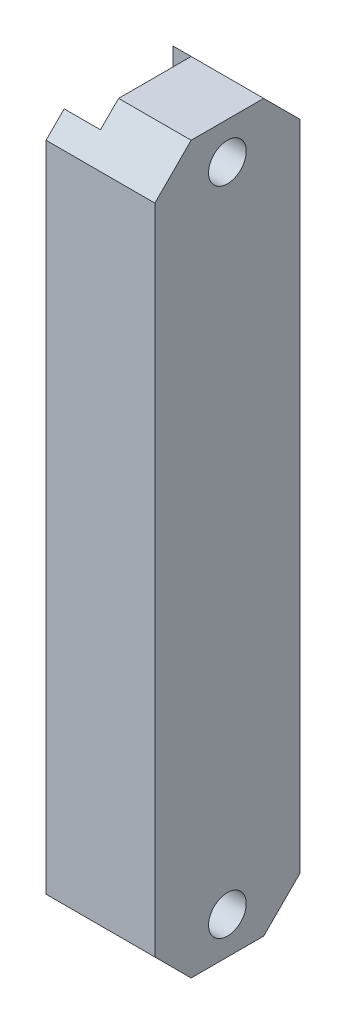
ISO-10303-21;
HEADER;
FILE_DESCRIPTION(('STEP AP214'),'2;1');
FILE_NAME('part.step','',(''),(''),'','','');
FILE_SCHEMA(('AUTOMOTIVE_DESIGN { 1 0 10303 214 1 1 1 1 }'));
ENDSEC;
DATA;
#1=APPLICATION_CONTEXT('core data for automotive mechanical design processes');
#2=APPLICATION_PROTOCOL_DEFINITION('international standard','automotive_design',2000,#1);
#3=PRODUCT_CONTEXT('',#1,'mechanical');
#4=PRODUCT('Part','Part','',(#3));
#5=PRODUCT_RELATED_PRODUCT_CATEGORY('part','',(#4));
#6=PRODUCT_DEFINITION_FORMATION('','',#4);
#7=PRODUCT_DEFINITION_CONTEXT('part definition',#1,'design');
#8=PRODUCT_DEFINITION('design','',#6,#7);
#9=PRODUCT_DEFINITION_SHAPE('','',#8);
#10=(LENGTH_UNIT() NAMED_UNIT(*) SI_UNIT(.MILLI.,.METRE.));
#11=(NAMED_UNIT(*) PLANE_ANGLE_UNIT() SI_UNIT($,.RADIAN.));
#12=(NAMED_UNIT(*) SI_UNIT($,.STERADIAN.) SOLID_ANGLE_UNIT());
#13=UNCERTAINTY_MEASURE_WITH_UNIT(LENGTH_MEASURE(1.E-05),#10,'distance_accuracy_value','');
#14=(GEOMETRIC_REPRESENTATION_CONTEXT(3) GLOBAL_UNCERTAINTY_ASSIGNED_CONTEXT((#13)) GLOBAL_UNIT_ASSIGNED_CONTEXT((#10,
#11,#12)) REPRESENTATION_CONTEXT('',''));
#15=CARTESIAN_POINT('',(0.,0.,0.));
#16=DIRECTION('',(0.,0.,1.));
#17=DIRECTION('',(1.,0.,0.));
#18=AXIS2_PLACEMENT_3D('',#15,#16,#17);
#19=CARTESIAN_POINT('',(-5.,100.,-9.99999999999999));
#20=DIRECTION('',(1.,0.,0.));
#21=DIRECTION('',(0.,0.,-1.));
#22=AXIS2_PLACEMENT_3D('',#19,#20,#21);
#23=PLANE('',#22);
#24=DIRECTION('',(0.,-1.,0.));
#25=VECTOR('',#24,1.);
#26=CARTESIAN_POINT('',(-5.,100.,-9.99999999999999));
#27=LINE('',#26,#25);
#28=CARTESIAN_POINT('',(-5.00000000000001,95.,-9.99999999999999));
#29=VERTEX_POINT('',#28);
#30=CARTESIAN_POINT('',(-5.00000000000001,5.,-9.99999999999999));
#31=VERTEX_POINT('',#30);
#32=EDGE_CURVE('E208',#29,#31,#27,.T.);
#33=ORIENTED_EDGE('',*,*,#32,.T.);
#34=DIRECTION('',(0.,0.707106781186548,-0.707106781186548));
#35=VECTOR('',#34,1.);
#36=CARTESIAN_POINT('',(-5.00000000000001,0.,-4.99999999999999));
#37=LINE('',#36,#35);
#38=CARTESIAN_POINT('',(-5.00000000000001,2.50000000000001,-7.5));
#39=VERTEX_POINT('',#38);
#40=EDGE_CURVE('E232',#39,#31,#37,.T.);
#41=ORIENTED_EDGE('',*,*,#40,.F.);
#42=DIRECTION('',(0.,-1.,0.));
#43=VECTOR('',#42,1.);
#44=CARTESIAN_POINT('',(-5.,100.,-7.5));
#45=LINE('',#44,#43);
#46=CARTESIAN_POINT('',(-5.00000000000001,97.5,-7.5));
#47=VERTEX_POINT('',#46);
#48=EDGE_CURVE('E11',#47,#39,#45,.T.);
#49=ORIENTED_EDGE('',*,*,#48,.F.);
#50=DIRECTION('',(0.,0.707106781186548,0.707106781186547));
#51=VECTOR('',#50,1.);
#52=CARTESIAN_POINT('',(-5.00000000000001,100.,-4.99999999999999));
#53=LINE('',#52,#51);
#54=EDGE_CURVE('E141',#29,#47,#53,.T.);
#55=ORIENTED_EDGE('',*,*,#54,.F.);
#56=EDGE_LOOP('',(#33,#41,#49,#55));
#57=FACE_BOUND('',#56,.T.);
#58=ADVANCED_FACE('F35',(#57),#23,.F.);
#59=CARTESIAN_POINT('',(-5.,100.,-7.5));
#60=DIRECTION('',(0.,0.,-1.));
#61=DIRECTION('',(-1.,0.,0.));
#62=AXIS2_PLACEMENT_3D('',#59,#60,#61);
#63=PLANE('',#62);
#64=ORIENTED_EDGE('',*,*,#48,.T.);
#65=DIRECTION('',(1.,0.,0.));
#66=VECTOR('',#65,1.);
#67=CARTESIAN_POINT('',(-5.00000000000002,2.5,-7.5));
#68=LINE('',#67,#66);
#69=CARTESIAN_POINT('',(0.,2.5,-7.5));
#70=VERTEX_POINT('',#69);
#71=EDGE_CURVE('E171',#39,#70,#68,.T.);
#72=ORIENTED_EDGE('',*,*,#71,.T.);
#73=DIRECTION('',(0.,-1.,0.));
#74=VECTOR('',#73,1.);
#75=CARTESIAN_POINT('',(0.,100.,-7.5));
#76=LINE('',#75,#74);
#77=CARTESIAN_POINT('',(0.,97.5,-7.5));
#78=VERTEX_POINT('',#77);
#79=EDGE_CURVE('E42',#78,#70,#76,.T.);
#80=ORIENTED_EDGE('',*,*,#79,.F.);
#81=DIRECTION('',(-1.,0.,0.));
#82=VECTOR('',#81,1.);
#83=CARTESIAN_POINT('',(-5.,97.5,-7.5));
#84=LINE('',#83,#82);
#85=EDGE_CURVE('E169',#78,#47,#84,.T.);
#86=ORIENTED_EDGE('',*,*,#85,.T.);
#87=EDGE_LOOP('',(#64,#72,#80,#86));
#88=FACE_BOUND('',#87,.T.);
#89=ADVANCED_FACE('F168',(#88),#63,.F.);
#90=CARTESIAN_POINT('',(0.,100.,-7.5));
#91=DIRECTION('',(1.,0.,0.));
#92=DIRECTION('',(0.,0.,-1.));
#93=AXIS2_PLACEMENT_3D('',#90,#91,#92);
#94=PLANE('',#93);
#95=CARTESIAN_POINT('',(0.,5.09871939465425,0.));
#96=DIRECTION('',(1.,0.,0.));
#97=DIRECTION('',(0.,0.,-1.));
#98=AXIS2_PLACEMENT_3D('',#95,#96,#97);
#99=CIRCLE('',#98,2.6);
#100=CARTESIAN_POINT('',(0.,5.09871939465425,2.6));
#101=VERTEX_POINT('',#100);
#102=EDGE_CURVE('E191',#101,#101,#99,.T.);
#103=ORIENTED_EDGE('',*,*,#102,.T.);
#104=EDGE_LOOP('',(#103));
#105=FACE_BOUND('',#104,.T.);
#106=CARTESIAN_POINT('',(0.,94.9012806053457,0.));
#107=DIRECTION('',(1.,0.,0.));
#108=DIRECTION('',(0.,0.,-1.));
#109=AXIS2_PLACEMENT_3D('',#106,#107,#108);
#110=CIRCLE('',#109,2.6);
#111=CARTESIAN_POINT('',(0.,94.9012806053457,2.60000000000001));
#112=VERTEX_POINT('',#111);
#113=EDGE_CURVE('E197',#112,#112,#110,.T.);
#114=ORIENTED_EDGE('',*,*,#113,.T.);
#115=EDGE_LOOP('',(#114));
#116=FACE_BOUND('',#115,.T.);
#117=DIRECTION('',(0.,0.,1.));
#118=VECTOR('',#117,1.);
#119=CARTESIAN_POINT('',(0.,0.,-7.5));
#120=LINE('',#119,#118);
#121=CARTESIAN_POINT('',(0.,0.,-4.99999999999999));
#122=VERTEX_POINT('',#121);
#123=CARTESIAN_POINT('',(0.,0.,4.99999999999999));
#124=VERTEX_POINT('',#123);
#125=EDGE_CURVE('E200',#122,#124,#120,.T.);
#126=ORIENTED_EDGE('',*,*,#125,.T.);
#127=DIRECTION('',(0.,0.707106781186547,0.707106781186547));
#128=VECTOR('',#127,1.);
#129=CARTESIAN_POINT('',(0.,43.75,48.75));
#130=LINE('',#129,#128);
#131=CARTESIAN_POINT('',(0.,2.5,7.5));
#132=VERTEX_POINT('',#131);
#133=EDGE_CURVE('E177',#124,#132,#130,.T.);
#134=ORIENTED_EDGE('',*,*,#133,.T.);
#135=DIRECTION('',(0.,-1.,0.));
#136=VECTOR('',#135,1.);
#137=CARTESIAN_POINT('',(0.,100.,7.5));
#138=LINE('',#137,#136);
#139=CARTESIAN_POINT('',(0.,97.5,7.5));
#140=VERTEX_POINT('',#139);
#141=EDGE_CURVE('E149',#140,#132,#138,.T.);
#142=ORIENTED_EDGE('',*,*,#141,.F.);
#143=DIRECTION('',(0.,0.707106781186548,-0.707106781186547));
#144=VECTOR('',#143,1.);
#145=CARTESIAN_POINT('',(0.,106.25,-1.25));
#146=LINE('',#145,#144);
#147=CARTESIAN_POINT('',(0.,100.,4.99999999999999));
#148=VERTEX_POINT('',#147);
#149=EDGE_CURVE('E188',#140,#148,#146,.T.);
#150=ORIENTED_EDGE('',*,*,#149,.T.);
#151=DIRECTION('',(0.,0.,1.));
#152=VECTOR('',#151,1.);
#153=CARTESIAN_POINT('',(0.,100.,-7.5));
#154=LINE('',#153,#152);
#155=CARTESIAN_POINT('',(0.,100.,-5.));
#156=VERTEX_POINT('',#155);
#157=EDGE_CURVE('E201',#156,#148,#154,.T.);
#158=ORIENTED_EDGE('',*,*,#157,.F.);
#159=DIRECTION('',(0.,-0.707106781186548,-0.707106781186547));
#160=VECTOR('',#159,1.);
#161=CARTESIAN_POINT('',(0.,98.75,-6.25));
#162=LINE('',#161,#160);
#163=EDGE_CURVE('E57',#156,#78,#162,.T.);
#164=ORIENTED_EDGE('',*,*,#163,.T.);
#165=ORIENTED_EDGE('',*,*,#79,.T.);
#166=DIRECTION('',(0.,-0.707106781186547,0.707106781186547));
#167=VECTOR('',#166,1.);
#168=CARTESIAN_POINT('',(0.,51.25,-56.25));
#169=LINE('',#168,#167);
#170=EDGE_CURVE('E162',#70,#122,#169,.T.);
#171=ORIENTED_EDGE('',*,*,#170,.T.);
#172=EDGE_LOOP('',(#126,#134,#142,#150,#158,#164,#165,#171));
#173=FACE_BOUND('',#172,.T.);
#174=ADVANCED_FACE('F161',(#105,#116,#173),#94,.F.);
#175=CARTESIAN_POINT('',(0.,100.,7.5));
#176=DIRECTION('',(0.,0.,1.));
#177=DIRECTION('',(1.,0.,0.));
#178=AXIS2_PLACEMENT_3D('',#175,#176,#177);
#179=PLANE('',#178);
#180=ORIENTED_EDGE('',*,*,#141,.T.);
#181=DIRECTION('',(-1.,0.,0.));
#182=VECTOR('',#181,1.);
#183=CARTESIAN_POINT('',(0.,2.5,7.5));
#184=LINE('',#183,#182);
#185=CARTESIAN_POINT('',(-5.00000000000001,2.50000000000002,7.50000000000001));
#186=VERTEX_POINT('',#185);
#187=EDGE_CURVE('E174',#132,#186,#184,.T.);
#188=ORIENTED_EDGE('',*,*,#187,.T.);
#189=DIRECTION('',(0.,-1.,0.));
#190=VECTOR('',#189,1.);
#191=CARTESIAN_POINT('',(-5.,100.,7.5));
#192=LINE('',#191,#190);
#193=CARTESIAN_POINT('',(-5.00000000000001,97.5,7.5));
#194=VERTEX_POINT('',#193);
#195=EDGE_CURVE('E147',#194,#186,#192,.T.);
#196=ORIENTED_EDGE('',*,*,#195,.F.);
#197=DIRECTION('',(1.,0.,0.));
#198=VECTOR('',#197,1.);
#199=CARTESIAN_POINT('',(0.,97.5,7.5));
#200=LINE('',#199,#198);
#201=EDGE_CURVE('E126',#194,#140,#200,.T.);
#202=ORIENTED_EDGE('',*,*,#201,.T.);
#203=EDGE_LOOP('',(#180,#188,#196,#202));
#204=FACE_BOUND('',#203,.T.);
#205=ADVANCED_FACE('F277',(#204),#179,.F.);
#206=CARTESIAN_POINT('',(-5.,100.,7.5));
#207=DIRECTION('',(1.,0.,0.));
#208=DIRECTION('',(0.,0.,-1.));
#209=AXIS2_PLACEMENT_3D('',#206,#207,#208);
#210=PLANE('',#209);
#211=ORIENTED_EDGE('',*,*,#195,.T.);
#212=DIRECTION('',(0.,-0.707106781186548,-0.707106781186548));
#213=VECTOR('',#212,1.);
#214=CARTESIAN_POINT('',(-5.00000000000001,0.,5.));
#215=LINE('',#214,#213);
#216=CARTESIAN_POINT('',(-5.,5.,9.99999999999999));
#217=VERTEX_POINT('',#216);
#218=EDGE_CURVE('E146',#217,#186,#215,.T.);
#219=ORIENTED_EDGE('',*,*,#218,.F.);
#220=DIRECTION('',(0.,-1.,0.));
#221=VECTOR('',#220,1.);
#222=CARTESIAN_POINT('',(-5.,100.,10.));
#223=LINE('',#222,#221);
#224=CARTESIAN_POINT('',(-5.,95.,9.99999999999999));
#225=VERTEX_POINT('',#224);
#226=EDGE_CURVE('E138',#225,#217,#223,.T.);
#227=ORIENTED_EDGE('',*,*,#226,.F.);
#228=DIRECTION('',(0.,-0.707106781186548,0.707106781186547));
#229=VECTOR('',#228,1.);
#230=CARTESIAN_POINT('',(-5.00000000000001,100.,5.));
#231=LINE('',#230,#229);
#232=EDGE_CURVE('E121',#194,#225,#231,.T.);
#233=ORIENTED_EDGE('',*,*,#232,.F.);
#234=EDGE_LOOP('',(#211,#219,#227,#233));
#235=FACE_BOUND('',#234,.T.);
#236=ADVANCED_FACE('F145',(#235),#210,.F.);
#237=CARTESIAN_POINT('',(-5.,100.,10.));
#238=DIRECTION('',(0.,0.,-1.));
#239=DIRECTION('',(-1.,0.,0.));
#240=AXIS2_PLACEMENT_3D('',#237,#238,#239);
#241=PLANE('',#240);
#242=ORIENTED_EDGE('',*,*,#226,.T.);
#243=DIRECTION('',(-1.,0.,0.));
#244=VECTOR('',#243,1.);
#245=CARTESIAN_POINT('',(10.,5.,9.99999999999999));
#246=LINE('',#245,#244);
#247=CARTESIAN_POINT('',(10.,5.,9.99999999999999));
#248=VERTEX_POINT('',#247);
#249=EDGE_CURVE('E235',#248,#217,#246,.T.);
#250=ORIENTED_EDGE('',*,*,#249,.F.);
#251=DIRECTION('',(0.,-1.,0.));
#252=VECTOR('',#251,1.);
#253=CARTESIAN_POINT('',(10.,100.,10.));
#254=LINE('',#253,#252);
#255=CARTESIAN_POINT('',(10.,95.,9.99999999999999));
#256=VERTEX_POINT('',#255);
#257=EDGE_CURVE('E140',#256,#248,#254,.T.);
#258=ORIENTED_EDGE('',*,*,#257,.F.);
#259=DIRECTION('',(-1.,0.,0.));
#260=VECTOR('',#259,1.);
#261=CARTESIAN_POINT('',(10.,95.,9.99999999999999));
#262=LINE('',#261,#260);
#263=EDGE_CURVE('E124',#256,#225,#262,.T.);
#264=ORIENTED_EDGE('',*,*,#263,.T.);
#265=EDGE_LOOP('',(#242,#250,#258,#264));
#266=FACE_BOUND('',#265,.T.);
#267=ADVANCED_FACE('F136',(#266),#241,.F.);
#268=CARTESIAN_POINT('',(10.,100.,10.));
#269=DIRECTION('',(-1.,0.,0.));
#270=DIRECTION('',(0.,0.,1.));
#271=AXIS2_PLACEMENT_3D('',#268,#269,#270);
#272=PLANE('',#271);
#273=CARTESIAN_POINT('',(10.,5.09871939465425,0.));
#274=DIRECTION('',(-1.,0.,0.));
#275=DIRECTION('',(0.,0.,1.));
#276=AXIS2_PLACEMENT_3D('',#273,#274,#275);
#277=CIRCLE('',#276,2.6);
#278=CARTESIAN_POINT('',(10.,5.09871939465425,2.6));
#279=VERTEX_POINT('',#278);
#280=EDGE_CURVE('E179',#279,#279,#277,.T.);
#281=ORIENTED_EDGE('',*,*,#280,.T.);
#282=EDGE_LOOP('',(#281));
#283=FACE_BOUND('',#282,.T.);
#284=CARTESIAN_POINT('',(10.,94.9012806053457,0.));
#285=DIRECTION('',(-1.,0.,0.));
#286=DIRECTION('',(0.,0.,1.));
#287=AXIS2_PLACEMENT_3D('',#284,#285,#286);
#288=CIRCLE('',#287,2.6);
#289=CARTESIAN_POINT('',(10.,94.9012806053457,2.60000000000001));
#290=VERTEX_POINT('',#289);
#291=EDGE_CURVE('E194',#290,#290,#288,.T.);
#292=ORIENTED_EDGE('',*,*,#291,.T.);
#293=EDGE_LOOP('',(#292));
#294=FACE_BOUND('',#293,.T.);
#295=ORIENTED_EDGE('',*,*,#257,.T.);
#296=DIRECTION('',(0.,-0.707106781186548,-0.707106781186548));
#297=VECTOR('',#296,1.);
#298=CARTESIAN_POINT('',(10.,0.,4.99999999999999));
#299=LINE('',#298,#297);
#300=CARTESIAN_POINT('',(10.,0.,4.99999999999999));
#301=VERTEX_POINT('',#300);
#302=EDGE_CURVE('E241',#248,#301,#299,.T.);
#303=ORIENTED_EDGE('',*,*,#302,.T.);
#304=DIRECTION('',(0.,0.,-1.));
#305=VECTOR('',#304,1.);
#306=CARTESIAN_POINT('',(10.,0.,10.));
#307=LINE('',#306,#305);
#308=CARTESIAN_POINT('',(10.,0.,-5.));
#309=VERTEX_POINT('',#308);
#310=EDGE_CURVE('E205',#301,#309,#307,.T.);
#311=ORIENTED_EDGE('',*,*,#310,.T.);
#312=DIRECTION('',(0.,0.707106781186548,-0.707106781186548));
#313=VECTOR('',#312,1.);
#314=CARTESIAN_POINT('',(10.,0.,-5.));
#315=LINE('',#314,#313);
#316=CARTESIAN_POINT('',(10.,5.,-10.));
#317=VERTEX_POINT('',#316);
#318=EDGE_CURVE('E227',#309,#317,#315,.T.);
#319=ORIENTED_EDGE('',*,*,#318,.T.);
#320=DIRECTION('',(0.,-1.,0.));
#321=VECTOR('',#320,1.);
#322=CARTESIAN_POINT('',(9.99999999999999,100.,-10.));
#323=LINE('',#322,#321);
#324=CARTESIAN_POINT('',(10.,95.,-10.));
#325=VERTEX_POINT('',#324);
#326=EDGE_CURVE('E151',#325,#317,#323,.T.);
#327=ORIENTED_EDGE('',*,*,#326,.F.);
#328=DIRECTION('',(0.,0.707106781186548,0.707106781186547));
#329=VECTOR('',#328,1.);
#330=CARTESIAN_POINT('',(10.,100.,-5.));
#331=LINE('',#330,#329);
#332=CARTESIAN_POINT('',(10.,100.,-5.));
#333=VERTEX_POINT('',#332);
#334=EDGE_CURVE('E226',#325,#333,#331,.T.);
#335=ORIENTED_EDGE('',*,*,#334,.T.);
#336=DIRECTION('',(0.,0.,-1.));
#337=VECTOR('',#336,1.);
#338=CARTESIAN_POINT('',(10.,100.,10.));
#339=LINE('',#338,#337);
#340=CARTESIAN_POINT('',(10.,100.,4.99999999999999));
#341=VERTEX_POINT('',#340);
#342=EDGE_CURVE('E204',#341,#333,#339,.T.);
#343=ORIENTED_EDGE('',*,*,#342,.F.);
#344=DIRECTION('',(0.,-0.707106781186548,0.707106781186547));
#345=VECTOR('',#344,1.);
#346=CARTESIAN_POINT('',(10.,100.,4.99999999999999));
#347=LINE('',#346,#345);
#348=EDGE_CURVE('E49',#341,#256,#347,.T.);
#349=ORIENTED_EDGE('',*,*,#348,.T.);
#350=EDGE_LOOP('',(#295,#303,#311,#319,#327,#335,#343,#349));
#351=FACE_BOUND('',#350,.T.);
#352=ADVANCED_FACE('F224',(#283,#294,#351),#272,.F.);
#353=CARTESIAN_POINT('',(9.99999999999999,100.,-10.));
#354=DIRECTION('',(0.,0.,1.));
#355=DIRECTION('',(1.,0.,0.));
#356=AXIS2_PLACEMENT_3D('',#353,#354,#355);
#357=PLANE('',#356);
#358=ORIENTED_EDGE('',*,*,#326,.T.);
#359=DIRECTION('',(-1.,0.,0.));
#360=VECTOR('',#359,1.);
#361=CARTESIAN_POINT('',(10.,5.,-10.));
#362=LINE('',#361,#360);
#363=EDGE_CURVE('E131',#317,#31,#362,.T.);
#364=ORIENTED_EDGE('',*,*,#363,.T.);
#365=ORIENTED_EDGE('',*,*,#32,.F.);
#366=DIRECTION('',(-1.,0.,0.));
#367=VECTOR('',#366,1.);
#368=CARTESIAN_POINT('',(10.,95.,-10.));
#369=LINE('',#368,#367);
#370=EDGE_CURVE('E220',#325,#29,#369,.T.);
#371=ORIENTED_EDGE('',*,*,#370,.F.);
#372=EDGE_LOOP('',(#358,#364,#365,#371));
#373=FACE_BOUND('',#372,.T.);
#374=ADVANCED_FACE('F218',(#373),#357,.F.);
#375=CARTESIAN_POINT('',(0.,100.,0.));
#376=DIRECTION('',(0.,1.,0.));
#377=DIRECTION('',(0.,0.,1.));
#378=AXIS2_PLACEMENT_3D('',#375,#376,#377);
#379=PLANE('',#378);
#380=DIRECTION('',(-1.,0.,0.));
#381=VECTOR('',#380,1.);
#382=CARTESIAN_POINT('',(10.,100.,4.99999999999999));
#383=LINE('',#382,#381);
#384=EDGE_CURVE('E142',#341,#148,#383,.T.);
#385=ORIENTED_EDGE('',*,*,#384,.F.);
#386=ORIENTED_EDGE('',*,*,#342,.T.);
#387=DIRECTION('',(-1.,0.,0.));
#388=VECTOR('',#387,1.);
#389=CARTESIAN_POINT('',(10.,100.,-5.));
#390=LINE('',#389,#388);
#391=EDGE_CURVE('E249',#333,#156,#390,.T.);
#392=ORIENTED_EDGE('',*,*,#391,.T.);
#393=ORIENTED_EDGE('',*,*,#157,.T.);
#394=EDGE_LOOP('',(#385,#386,#392,#393));
#395=FACE_BOUND('',#394,.T.);
#396=ADVANCED_FACE('F293',(#395),#379,.T.);
#397=CARTESIAN_POINT('',(0.,0.,0.));
#398=DIRECTION('',(0.,1.,0.));
#399=DIRECTION('',(0.,0.,1.));
#400=AXIS2_PLACEMENT_3D('',#397,#398,#399);
#401=PLANE('',#400);
#402=ORIENTED_EDGE('',*,*,#310,.F.);
#403=DIRECTION('',(-1.,0.,0.));
#404=VECTOR('',#403,1.);
#405=CARTESIAN_POINT('',(10.,0.,4.99999999999999));
#406=LINE('',#405,#404);
#407=EDGE_CURVE('E243',#301,#124,#406,.T.);
#408=ORIENTED_EDGE('',*,*,#407,.T.);
#409=ORIENTED_EDGE('',*,*,#125,.F.);
#410=DIRECTION('',(-1.,0.,0.));
#411=VECTOR('',#410,1.);
#412=CARTESIAN_POINT('',(10.,0.,-5.));
#413=LINE('',#412,#411);
#414=EDGE_CURVE('E231',#309,#122,#413,.T.);
#415=ORIENTED_EDGE('',*,*,#414,.F.);
#416=EDGE_LOOP('',(#402,#408,#409,#415));
#417=FACE_BOUND('',#416,.T.);
#418=ADVANCED_FACE('F266',(#417),#401,.F.);
#419=CARTESIAN_POINT('',(10.,94.9012806053457,0.));
#420=DIRECTION('',(-1.,0.,0.));
#421=DIRECTION('',(0.,0.,1.));
#422=AXIS2_PLACEMENT_3D('',#419,#420,#421);
#423=CYLINDRICAL_SURFACE('',#422,2.6);
#424=CARTESIAN_POINT('',(10.,94.9012806053457,2.60000000000001));
#425=CARTESIAN_POINT('',(9.89583333333334,94.9012806053457,2.60000000000001));
#426=CARTESIAN_POINT('',(9.79166666666667,94.9012806053457,2.60000000000001));
#427=CARTESIAN_POINT('',(9.58333333333334,94.9012806053457,2.60000000000001));
#428=CARTESIAN_POINT('',(9.47916666666667,94.9012806053457,2.60000000000001));
#429=CARTESIAN_POINT('',(9.27083333333334,94.9012806053457,2.60000000000001));
#430=CARTESIAN_POINT('',(9.16666666666667,94.9012806053457,2.60000000000001));
#431=CARTESIAN_POINT('',(8.95833333333334,94.9012806053457,2.60000000000001));
#432=CARTESIAN_POINT('',(8.85416666666667,94.9012806053457,2.60000000000001));
#433=CARTESIAN_POINT('',(8.64583333333334,94.9012806053457,2.60000000000001));
#434=CARTESIAN_POINT('',(8.54166666666667,94.9012806053457,2.60000000000001));
#435=CARTESIAN_POINT('',(8.33333333333334,94.9012806053457,2.60000000000001));
#436=CARTESIAN_POINT('',(8.22916666666667,94.9012806053457,2.60000000000001));
#437=CARTESIAN_POINT('',(8.02083333333334,94.9012806053457,2.60000000000001));
#438=CARTESIAN_POINT('',(7.91666666666667,94.9012806053457,2.60000000000001));
#439=CARTESIAN_POINT('',(7.70833333333334,94.9012806053457,2.60000000000001));
#440=CARTESIAN_POINT('',(7.60416666666667,94.9012806053457,2.60000000000001));
#441=CARTESIAN_POINT('',(7.39583333333334,94.9012806053457,2.60000000000001));
#442=CARTESIAN_POINT('',(7.29166666666667,94.9012806053457,2.60000000000001));
#443=CARTESIAN_POINT('',(7.08333333333334,94.9012806053457,2.60000000000001));
#444=CARTESIAN_POINT('',(6.97916666666667,94.9012806053457,2.60000000000001));
#445=CARTESIAN_POINT('',(6.77083333333334,94.9012806053457,2.60000000000001));
#446=CARTESIAN_POINT('',(6.66666666666667,94.9012806053457,2.60000000000001));
#447=CARTESIAN_POINT('',(6.45833333333334,94.9012806053457,2.60000000000001));
#448=CARTESIAN_POINT('',(6.35416666666667,94.9012806053457,2.60000000000001));
#449=CARTESIAN_POINT('',(6.14583333333334,94.9012806053457,2.60000000000001));
#450=CARTESIAN_POINT('',(6.04166666666667,94.9012806053457,2.60000000000001));
#451=CARTESIAN_POINT('',(5.83333333333334,94.9012806053457,2.60000000000001));
#452=CARTESIAN_POINT('',(5.72916666666667,94.9012806053457,2.60000000000001));
#453=CARTESIAN_POINT('',(5.52083333333334,94.9012806053457,2.60000000000001));
#454=CARTESIAN_POINT('',(5.41666666666667,94.9012806053457,2.60000000000001));
#455=CARTESIAN_POINT('',(5.20833333333334,94.9012806053457,2.60000000000001));
#456=CARTESIAN_POINT('',(5.10416666666667,94.9012806053457,2.60000000000001));
#457=CARTESIAN_POINT('',(4.89583333333334,94.9012806053457,2.60000000000001));
#458=CARTESIAN_POINT('',(4.79166666666667,94.9012806053457,2.60000000000001));
#459=CARTESIAN_POINT('',(4.58333333333334,94.9012806053457,2.60000000000001));
#460=CARTESIAN_POINT('',(4.47916666666667,94.9012806053457,2.60000000000001));
#461=CARTESIAN_POINT('',(4.27083333333334,94.9012806053457,2.60000000000001));
#462=CARTESIAN_POINT('',(4.16666666666667,94.9012806053457,2.60000000000001));
#463=CARTESIAN_POINT('',(3.95833333333334,94.9012806053457,2.60000000000001));
#464=CARTESIAN_POINT('',(3.85416666666667,94.9012806053457,2.60000000000001));
#465=CARTESIAN_POINT('',(3.64583333333334,94.9012806053457,2.60000000000001));
#466=CARTESIAN_POINT('',(3.54166666666667,94.9012806053457,2.60000000000001));
#467=CARTESIAN_POINT('',(3.33333333333334,94.9012806053457,2.60000000000001));
#468=CARTESIAN_POINT('',(3.22916666666667,94.9012806053457,2.60000000000001));
#469=CARTESIAN_POINT('',(3.02083333333334,94.9012806053457,2.60000000000001));
#470=CARTESIAN_POINT('',(2.91666666666667,94.9012806053457,2.60000000000001));
#471=CARTESIAN_POINT('',(2.70833333333334,94.9012806053457,2.60000000000001));
#472=CARTESIAN_POINT('',(2.60416666666667,94.9012806053457,2.60000000000001));
#473=CARTESIAN_POINT('',(2.39583333333334,94.9012806053457,2.60000000000001));
#474=CARTESIAN_POINT('',(2.29166666666667,94.9012806053457,2.60000000000001));
#475=CARTESIAN_POINT('',(2.08333333333334,94.9012806053457,2.60000000000001));
#476=CARTESIAN_POINT('',(1.97916666666667,94.9012806053457,2.60000000000001));
#477=CARTESIAN_POINT('',(1.77083333333334,94.9012806053457,2.60000000000001));
#478=CARTESIAN_POINT('',(1.66666666666667,94.9012806053457,2.60000000000001));
#479=CARTESIAN_POINT('',(1.45833333333334,94.9012806053457,2.60000000000001));
#480=CARTESIAN_POINT('',(1.35416666666667,94.9012806053457,2.60000000000001));
#481=CARTESIAN_POINT('',(1.14583333333334,94.9012806053457,2.60000000000001));
#482=CARTESIAN_POINT('',(1.04166666666667,94.9012806053457,2.60000000000001));
#483=CARTESIAN_POINT('',(0.833333333333337,94.9012806053457,2.60000000000001));
#484=CARTESIAN_POINT('',(0.729166666666671,94.9012806053457,2.60000000000001));
#485=CARTESIAN_POINT('',(0.520833333333337,94.9012806053457,2.60000000000001));
#486=CARTESIAN_POINT('',(0.41666666666667,94.9012806053457,2.60000000000001));
#487=CARTESIAN_POINT('',(0.208333333333337,94.9012806053457,2.60000000000001));
#488=CARTESIAN_POINT('',(0.10416666666667,94.9012806053457,2.60000000000001));
#489=CARTESIAN_POINT('',(0.,94.9012806053457,2.60000000000001));
#490=B_SPLINE_CURVE_WITH_KNOTS('',3,(#424,#425,#426,#427,#428,#429,#430,#431,#432,#433,#434,
#435,#436,#437,#438,#439,#440,#441,#442,#443,#444,#445,#446,#447,#448,#449,#450,#451,#452,#453,
#454,#455,#456,#457,#458,#459,#460,#461,#462,#463,#464,#465,#466,#467,#468,#469,#470,#471,#472,
#473,#474,#475,#476,#477,#478,#479,#480,#481,#482,#483,#484,#485,#486,#487,#488,#489),
.UNSPECIFIED.,.F.,.F.,(4,2,2,2,2,2,2,2,2,2,2,2,2,2,2,2,2,2,2,2,2,2,2,2,2,2,2,2,2,2,2,2,4),(0.,
0.312499999999999,0.624999999999999,0.937499999999999,1.25,1.5625,1.875,2.1875,2.5,2.8125,3.125,
3.4375,3.75,4.0625,4.375,4.6875,5.,5.3125,5.625,5.9375,6.25,6.5625,6.875,7.1875,7.5,7.8125,
8.125,8.4375,8.75,9.0625,9.375,9.6875,10.),.UNSPECIFIED.);
#491=EDGE_CURVE('BSEAM258',#290,#112,#490,.T.);
#492=ORIENTED_EDGE('',*,*,#291,.F.);
#493=ORIENTED_EDGE('',*,*,#113,.F.);
#494=ORIENTED_EDGE('',*,*,#491,.T.);
#495=ORIENTED_EDGE('',*,*,#491,.F.);
#496=EDGE_LOOP('',(#492,#494,#493,#495));
#497=FACE_BOUND('',#496,.T.);
#498=ADVANCED_FACE('F258',(#497),#423,.F.);
#499=CARTESIAN_POINT('',(10.,0.,-5.));
#500=DIRECTION('',(0.,0.707106781186547,0.707106781186547));
#501=DIRECTION('',(0.,-0.707106781186548,0.707106781186548));
#502=AXIS2_PLACEMENT_3D('',#499,#500,#501);
#503=PLANE('',#502);
#504=ORIENTED_EDGE('',*,*,#40,.T.);
#505=ORIENTED_EDGE('',*,*,#363,.F.);
#506=ORIENTED_EDGE('',*,*,#318,.F.);
#507=ORIENTED_EDGE('',*,*,#414,.T.);
#508=ORIENTED_EDGE('',*,*,#170,.F.);
#509=ORIENTED_EDGE('',*,*,#71,.F.);
#510=EDGE_LOOP('',(#504,#505,#506,#507,#508,#509));
#511=FACE_BOUND('',#510,.T.);
#512=ADVANCED_FACE('F255',(#511),#503,.F.);
#513=CARTESIAN_POINT('',(10.,0.,4.99999999999999));
#514=DIRECTION('',(0.,0.707106781186547,-0.707106781186547));
#515=DIRECTION('',(0.,0.707106781186548,0.707106781186548));
#516=AXIS2_PLACEMENT_3D('',#513,#514,#515);
#517=PLANE('',#516);
#518=ORIENTED_EDGE('',*,*,#407,.F.);
#519=ORIENTED_EDGE('',*,*,#302,.F.);
#520=ORIENTED_EDGE('',*,*,#249,.T.);
#521=ORIENTED_EDGE('',*,*,#218,.T.);
#522=ORIENTED_EDGE('',*,*,#187,.F.);
#523=ORIENTED_EDGE('',*,*,#133,.F.);
#524=EDGE_LOOP('',(#518,#519,#520,#521,#522,#523));
#525=FACE_BOUND('',#524,.T.);
#526=ADVANCED_FACE('F257',(#525),#517,.F.);
#527=CARTESIAN_POINT('',(10.,100.,-5.));
#528=DIRECTION('',(0.,-0.707106781186547,0.707106781186548));
#529=DIRECTION('',(0.,-0.707106781186548,-0.707106781186547));
#530=AXIS2_PLACEMENT_3D('',#527,#528,#529);
#531=PLANE('',#530);
#532=ORIENTED_EDGE('',*,*,#163,.F.);
#533=ORIENTED_EDGE('',*,*,#391,.F.);
#534=ORIENTED_EDGE('',*,*,#334,.F.);
#535=ORIENTED_EDGE('',*,*,#370,.T.);
#536=ORIENTED_EDGE('',*,*,#54,.T.);
#537=ORIENTED_EDGE('',*,*,#85,.F.);
#538=EDGE_LOOP('',(#532,#533,#534,#535,#536,#537));
#539=FACE_BOUND('',#538,.T.);
#540=ADVANCED_FACE('F253',(#539),#531,.F.);
#541=CARTESIAN_POINT('',(10.,100.,4.99999999999999));
#542=DIRECTION('',(0.,-0.707106781186547,-0.707106781186548));
#543=DIRECTION('',(0.,0.707106781186548,-0.707106781186547));
#544=AXIS2_PLACEMENT_3D('',#541,#542,#543);
#545=PLANE('',#544);
#546=ORIENTED_EDGE('',*,*,#201,.F.);
#547=ORIENTED_EDGE('',*,*,#232,.T.);
#548=ORIENTED_EDGE('',*,*,#263,.F.);
#549=ORIENTED_EDGE('',*,*,#348,.F.);
#550=ORIENTED_EDGE('',*,*,#384,.T.);
#551=ORIENTED_EDGE('',*,*,#149,.F.);
#552=EDGE_LOOP('',(#546,#547,#548,#549,#550,#551));
#553=FACE_BOUND('',#552,.T.);
#554=ADVANCED_FACE('F123',(#553),#545,.F.);
#555=CARTESIAN_POINT('',(10.,5.09871939465425,0.));
#556=DIRECTION('',(-1.,0.,0.));
#557=DIRECTION('',(0.,0.,1.));
#558=AXIS2_PLACEMENT_3D('',#555,#556,#557);
#559=CYLINDRICAL_SURFACE('',#558,2.6);
#560=CARTESIAN_POINT('',(10.,5.09871939465425,2.6));
#561=CARTESIAN_POINT('',(9.89583333333334,5.09871939465425,2.6));
#562=CARTESIAN_POINT('',(9.79166666666667,5.09871939465425,2.6));
#563=CARTESIAN_POINT('',(9.58333333333334,5.09871939465425,2.6));
#564=CARTESIAN_POINT('',(9.47916666666667,5.09871939465425,2.6));
#565=CARTESIAN_POINT('',(9.27083333333334,5.09871939465425,2.6));
#566=CARTESIAN_POINT('',(9.16666666666667,5.09871939465425,2.6));
#567=CARTESIAN_POINT('',(8.95833333333334,5.09871939465425,2.6));
#568=CARTESIAN_POINT('',(8.85416666666667,5.09871939465425,2.6));
#569=CARTESIAN_POINT('',(8.64583333333334,5.09871939465425,2.6));
#570=CARTESIAN_POINT('',(8.54166666666667,5.09871939465425,2.6));
#571=CARTESIAN_POINT('',(8.33333333333334,5.09871939465425,2.6));
#572=CARTESIAN_POINT('',(8.22916666666667,5.09871939465425,2.6));
#573=CARTESIAN_POINT('',(8.02083333333334,5.09871939465425,2.6));
#574=CARTESIAN_POINT('',(7.91666666666667,5.09871939465425,2.6));
#575=CARTESIAN_POINT('',(7.70833333333334,5.09871939465425,2.6));
#576=CARTESIAN_POINT('',(7.60416666666667,5.09871939465425,2.6));
#577=CARTESIAN_POINT('',(7.39583333333334,5.09871939465425,2.6));
#578=CARTESIAN_POINT('',(7.29166666666667,5.09871939465425,2.6));
#579=CARTESIAN_POINT('',(7.08333333333334,5.09871939465425,2.6));
#580=CARTESIAN_POINT('',(6.97916666666667,5.09871939465425,2.6));
#581=CARTESIAN_POINT('',(6.77083333333334,5.09871939465425,2.6));
#582=CARTESIAN_POINT('',(6.66666666666667,5.09871939465425,2.6));
#583=CARTESIAN_POINT('',(6.45833333333334,5.09871939465425,2.6));
#584=CARTESIAN_POINT('',(6.35416666666667,5.09871939465425,2.6));
#585=CARTESIAN_POINT('',(6.14583333333334,5.09871939465425,2.6));
#586=CARTESIAN_POINT('',(6.04166666666667,5.09871939465425,2.6));
#587=CARTESIAN_POINT('',(5.83333333333334,5.09871939465425,2.6));
#588=CARTESIAN_POINT('',(5.72916666666667,5.09871939465425,2.6));
#589=CARTESIAN_POINT('',(5.52083333333334,5.09871939465425,2.6));
#590=CARTESIAN_POINT('',(5.41666666666667,5.09871939465425,2.6));
#591=CARTESIAN_POINT('',(5.20833333333334,5.09871939465425,2.6));
#592=CARTESIAN_POINT('',(5.10416666666667,5.09871939465425,2.6));
#593=CARTESIAN_POINT('',(4.89583333333334,5.09871939465425,2.6));
#594=CARTESIAN_POINT('',(4.79166666666667,5.09871939465425,2.6));
#595=CARTESIAN_POINT('',(4.58333333333334,5.09871939465425,2.6));
#596=CARTESIAN_POINT('',(4.47916666666667,5.09871939465425,2.6));
#597=CARTESIAN_POINT('',(4.27083333333334,5.09871939465425,2.6));
#598=CARTESIAN_POINT('',(4.16666666666667,5.09871939465425,2.6));
#599=CARTESIAN_POINT('',(3.95833333333334,5.09871939465425,2.6));
#600=CARTESIAN_POINT('',(3.85416666666667,5.09871939465425,2.6));
#601=CARTESIAN_POINT('',(3.64583333333334,5.09871939465425,2.6));
#602=CARTESIAN_POINT('',(3.54166666666667,5.09871939465425,2.6));
#603=CARTESIAN_POINT('',(3.33333333333334,5.09871939465425,2.6));
#604=CARTESIAN_POINT('',(3.22916666666667,5.09871939465425,2.6));
#605=CARTESIAN_POINT('',(3.02083333333334,5.09871939465425,2.6));
#606=CARTESIAN_POINT('',(2.91666666666667,5.09871939465425,2.6));
#607=CARTESIAN_POINT('',(2.70833333333334,5.09871939465425,2.6));
#608=CARTESIAN_POINT('',(2.60416666666667,5.09871939465425,2.6));
#609=CARTESIAN_POINT('',(2.39583333333334,5.09871939465425,2.6));
#610=CARTESIAN_POINT('',(2.29166666666667,5.09871939465425,2.6));
#611=CARTESIAN_POINT('',(2.08333333333334,5.09871939465425,2.6));
#612=CARTESIAN_POINT('',(1.97916666666667,5.09871939465425,2.6));
#613=CARTESIAN_POINT('',(1.77083333333334,5.09871939465425,2.6));
#614=CARTESIAN_POINT('',(1.66666666666667,5.09871939465425,2.6));
#615=CARTESIAN_POINT('',(1.45833333333334,5.09871939465425,2.6));
#616=CARTESIAN_POINT('',(1.35416666666667,5.09871939465425,2.6));
#617=CARTESIAN_POINT('',(1.14583333333334,5.09871939465425,2.6));
#618=CARTESIAN_POINT('',(1.04166666666667,5.09871939465425,2.6));
#619=CARTESIAN_POINT('',(0.833333333333337,5.09871939465425,2.6));
#620=CARTESIAN_POINT('',(0.729166666666671,5.09871939465425,2.6));
#621=CARTESIAN_POINT('',(0.520833333333337,5.09871939465425,2.6));
#622=CARTESIAN_POINT('',(0.41666666666667,5.09871939465425,2.6));
#623=CARTESIAN_POINT('',(0.208333333333337,5.09871939465425,2.6));
#624=CARTESIAN_POINT('',(0.10416666666667,5.09871939465425,2.6));
#625=CARTESIAN_POINT('',(0.,5.09871939465425,2.6));
#626=B_SPLINE_CURVE_WITH_KNOTS('',3,(#560,#561,#562,#563,#564,#565,#566,#567,#568,#569,#570,
#571,#572,#573,#574,#575,#576,#577,#578,#579,#580,#581,#582,#583,#584,#585,#586,#587,#588,#589,
#590,#591,#592,#593,#594,#595,#596,#597,#598,#599,#600,#601,#602,#603,#604,#605,#606,#607,#608,
#609,#610,#611,#612,#613,#614,#615,#616,#617,#618,#619,#620,#621,#622,#623,#624,#625),
.UNSPECIFIED.,.F.,.F.,(4,2,2,2,2,2,2,2,2,2,2,2,2,2,2,2,2,2,2,2,2,2,2,2,2,2,2,2,2,2,2,2,4),(0.,
0.312499999999999,0.624999999999999,0.937499999999999,1.25,1.5625,1.875,2.1875,2.5,2.8125,3.125,
3.4375,3.75,4.0625,4.375,4.6875,5.,5.3125,5.625,5.9375,6.25,6.5625,6.875,7.1875,7.5,7.8125,
8.125,8.4375,8.75,9.0625,9.375,9.6875,10.),.UNSPECIFIED.);
#627=EDGE_CURVE('BSEAM302',#279,#101,#626,.T.);
#628=ORIENTED_EDGE('',*,*,#280,.F.);
#629=ORIENTED_EDGE('',*,*,#102,.F.);
#630=ORIENTED_EDGE('',*,*,#627,.T.);
#631=ORIENTED_EDGE('',*,*,#627,.F.);
#632=EDGE_LOOP('',(#628,#630,#629,#631));
#633=FACE_BOUND('',#632,.T.);
#634=ADVANCED_FACE('F302',(#633),#559,.F.);
#635=CLOSED_SHELL('',(#58,#89,#174,#205,#236,#267,#352,#374,#396,#418,#498,#512,#526,#540,#554,#634));
#636=MANIFOLD_SOLID_BREP('B2',#635);
#637=ADVANCED_BREP_SHAPE_REPRESENTATION('',(#18,#636),#14);
#638=SHAPE_DEFINITION_REPRESENTATION(#9,#637);
ENDSEC;
END-ISO-10303-21;
